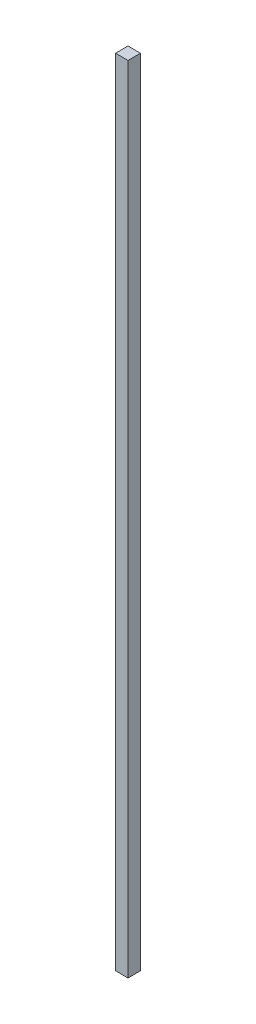
ISO-10303-21;
HEADER;
FILE_DESCRIPTION(('STEP AP214'),'2;1');
FILE_NAME('part.step','',(''),(''),'','','');
FILE_SCHEMA(('AUTOMOTIVE_DESIGN { 1 0 10303 214 1 1 1 1 }'));
ENDSEC;
DATA;
#1=APPLICATION_CONTEXT('core data for automotive mechanical design processes');
#2=APPLICATION_PROTOCOL_DEFINITION('international standard','automotive_design',2000,#1);
#3=PRODUCT_CONTEXT('',#1,'mechanical');
#4=PRODUCT('Part','Part','',(#3));
#5=PRODUCT_RELATED_PRODUCT_CATEGORY('part','',(#4));
#6=PRODUCT_DEFINITION_FORMATION('','',#4);
#7=PRODUCT_DEFINITION_CONTEXT('part definition',#1,'design');
#8=PRODUCT_DEFINITION('design','',#6,#7);
#9=PRODUCT_DEFINITION_SHAPE('','',#8);
#10=(LENGTH_UNIT() NAMED_UNIT(*) SI_UNIT(.MILLI.,.METRE.));
#11=(NAMED_UNIT(*) PLANE_ANGLE_UNIT() SI_UNIT($,.RADIAN.));
#12=(NAMED_UNIT(*) SI_UNIT($,.STERADIAN.) SOLID_ANGLE_UNIT());
#13=UNCERTAINTY_MEASURE_WITH_UNIT(LENGTH_MEASURE(1.E-05),#10,'distance_accuracy_value','');
#14=(GEOMETRIC_REPRESENTATION_CONTEXT(3) GLOBAL_UNCERTAINTY_ASSIGNED_CONTEXT((#13)) GLOBAL_UNIT_ASSIGNED_CONTEXT((#10,
#11,#12)) REPRESENTATION_CONTEXT('',''));
#15=CARTESIAN_POINT('',(0.,0.,0.));
#16=DIRECTION('',(0.,0.,1.));
#17=DIRECTION('',(1.,0.,0.));
#18=AXIS2_PLACEMENT_3D('',#15,#16,#17);
#19=CARTESIAN_POINT('',(-42.531066264103,3180.,-16.6753535674559));
#20=DIRECTION('',(1.,0.,0.));
#21=DIRECTION('',(0.,0.,-1.));
#22=AXIS2_PLACEMENT_3D('',#19,#20,#21);
#23=PLANE('',#22);
#24=DIRECTION('',(0.,0.,1.));
#25=VECTOR('',#24,1.);
#26=CARTESIAN_POINT('',(-42.531066264103,0.,-16.6753535674559));
#27=LINE('',#26,#25);
#28=CARTESIAN_POINT('',(-42.531066264103,0.,-16.6753535674559));
#29=VERTEX_POINT('',#28);
#30=CARTESIAN_POINT('',(-42.531066264103,0.,33.3246464325441));
#31=VERTEX_POINT('',#30);
#32=EDGE_CURVE('E98',#29,#31,#27,.T.);
#33=ORIENTED_EDGE('',*,*,#32,.T.);
#34=DIRECTION('',(0.,-1.,0.));
#35=VECTOR('',#34,1.);
#36=CARTESIAN_POINT('',(-42.531066264103,3180.,33.3246464325441));
#37=LINE('',#36,#35);
#38=CARTESIAN_POINT('',(-42.531066264103,3180.,33.3246464325441));
#39=VERTEX_POINT('',#38);
#40=EDGE_CURVE('E11',#39,#31,#37,.T.);
#41=ORIENTED_EDGE('',*,*,#40,.F.);
#42=DIRECTION('',(0.,0.,1.));
#43=VECTOR('',#42,1.);
#44=CARTESIAN_POINT('',(-42.531066264103,3180.,-16.6753535674559));
#45=LINE('',#44,#43);
#46=CARTESIAN_POINT('',(-42.531066264103,3180.,-16.6753535674559));
#47=VERTEX_POINT('',#46);
#48=EDGE_CURVE('E86',#47,#39,#45,.T.);
#49=ORIENTED_EDGE('',*,*,#48,.F.);
#50=DIRECTION('',(0.,-1.,0.));
#51=VECTOR('',#50,1.);
#52=CARTESIAN_POINT('',(-42.531066264103,3180.,-16.6753535674559));
#53=LINE('',#52,#51);
#54=EDGE_CURVE('E94',#47,#29,#53,.T.);
#55=ORIENTED_EDGE('',*,*,#54,.T.);
#56=EDGE_LOOP('',(#33,#41,#49,#55));
#57=FACE_BOUND('',#56,.T.);
#58=ADVANCED_FACE('F35',(#57),#23,.F.);
#59=CARTESIAN_POINT('',(-42.531066264103,3180.,33.3246464325441));
#60=DIRECTION('',(0.,0.,-1.));
#61=DIRECTION('',(-1.,0.,0.));
#62=AXIS2_PLACEMENT_3D('',#59,#60,#61);
#63=PLANE('',#62);
#64=DIRECTION('',(1.,0.,0.));
#65=VECTOR('',#64,1.);
#66=CARTESIAN_POINT('',(-42.531066264103,0.,33.3246464325441));
#67=LINE('',#66,#65);
#68=CARTESIAN_POINT('',(7.46893373589703,0.,33.3246464325441));
#69=VERTEX_POINT('',#68);
#70=EDGE_CURVE('E90',#31,#69,#67,.T.);
#71=ORIENTED_EDGE('',*,*,#70,.T.);
#72=DIRECTION('',(0.,-1.,0.));
#73=VECTOR('',#72,1.);
#74=CARTESIAN_POINT('',(7.46893373589703,3180.,33.3246464325441));
#75=LINE('',#74,#73);
#76=CARTESIAN_POINT('',(7.46893373589703,3180.,33.3246464325441));
#77=VERTEX_POINT('',#76);
#78=EDGE_CURVE('E43',#77,#69,#75,.T.);
#79=ORIENTED_EDGE('',*,*,#78,.F.);
#80=DIRECTION('',(1.,0.,0.));
#81=VECTOR('',#80,1.);
#82=CARTESIAN_POINT('',(-42.531066264103,3180.,33.3246464325441));
#83=LINE('',#82,#81);
#84=EDGE_CURVE('E81',#39,#77,#83,.T.);
#85=ORIENTED_EDGE('',*,*,#84,.F.);
#86=ORIENTED_EDGE('',*,*,#40,.T.);
#87=EDGE_LOOP('',(#71,#79,#85,#86));
#88=FACE_BOUND('',#87,.T.);
#89=ADVANCED_FACE('F89',(#88),#63,.F.);
#90=CARTESIAN_POINT('',(7.46893373589703,3180.,-16.6753535674559));
#91=DIRECTION('',(-1.,0.,0.));
#92=DIRECTION('',(0.,0.,1.));
#93=AXIS2_PLACEMENT_3D('',#90,#91,#92);
#94=PLANE('',#93);
#95=DIRECTION('',(0.,0.,-1.));
#96=VECTOR('',#95,1.);
#97=CARTESIAN_POINT('',(7.46893373589703,0.,-16.6753535674559));
#98=LINE('',#97,#96);
#99=CARTESIAN_POINT('',(7.46893373589703,0.,-16.6753535674559));
#100=VERTEX_POINT('',#99);
#101=EDGE_CURVE('E68',#69,#100,#98,.T.);
#102=ORIENTED_EDGE('',*,*,#101,.T.);
#103=DIRECTION('',(0.,-1.,0.));
#104=VECTOR('',#103,1.);
#105=CARTESIAN_POINT('',(7.46893373589703,3180.,-16.6753535674559));
#106=LINE('',#105,#104);
#107=CARTESIAN_POINT('',(7.46893373589703,3180.,-16.6753535674559));
#108=VERTEX_POINT('',#107);
#109=EDGE_CURVE('E91',#108,#100,#106,.T.);
#110=ORIENTED_EDGE('',*,*,#109,.F.);
#111=DIRECTION('',(0.,0.,-1.));
#112=VECTOR('',#111,1.);
#113=CARTESIAN_POINT('',(7.46893373589703,3180.,-16.6753535674559));
#114=LINE('',#113,#112);
#115=EDGE_CURVE('E84',#77,#108,#114,.T.);
#116=ORIENTED_EDGE('',*,*,#115,.F.);
#117=ORIENTED_EDGE('',*,*,#78,.T.);
#118=EDGE_LOOP('',(#102,#110,#116,#117));
#119=FACE_BOUND('',#118,.T.);
#120=ADVANCED_FACE('F92',(#119),#94,.F.);
#121=CARTESIAN_POINT('',(-42.531066264103,3180.,-16.6753535674559));
#122=DIRECTION('',(0.,0.,1.));
#123=DIRECTION('',(1.,0.,0.));
#124=AXIS2_PLACEMENT_3D('',#121,#122,#123);
#125=PLANE('',#124);
#126=DIRECTION('',(-1.,0.,0.));
#127=VECTOR('',#126,1.);
#128=CARTESIAN_POINT('',(-42.531066264103,0.,-16.6753535674559));
#129=LINE('',#128,#127);
#130=EDGE_CURVE('E74',#100,#29,#129,.T.);
#131=ORIENTED_EDGE('',*,*,#130,.T.);
#132=ORIENTED_EDGE('',*,*,#54,.F.);
#133=DIRECTION('',(-1.,0.,0.));
#134=VECTOR('',#133,1.);
#135=CARTESIAN_POINT('',(-42.531066264103,3180.,-16.6753535674559));
#136=LINE('',#135,#134);
#137=EDGE_CURVE('E51',#108,#47,#136,.T.);
#138=ORIENTED_EDGE('',*,*,#137,.F.);
#139=ORIENTED_EDGE('',*,*,#109,.T.);
#140=EDGE_LOOP('',(#131,#132,#138,#139));
#141=FACE_BOUND('',#140,.T.);
#142=ADVANCED_FACE('F105',(#141),#125,.F.);
#143=CARTESIAN_POINT('',(0.,3180.,0.));
#144=DIRECTION('',(0.,1.,0.));
#145=DIRECTION('',(0.,0.,1.));
#146=AXIS2_PLACEMENT_3D('',#143,#144,#145);
#147=PLANE('',#146);
#148=ORIENTED_EDGE('',*,*,#48,.T.);
#149=ORIENTED_EDGE('',*,*,#84,.T.);
#150=ORIENTED_EDGE('',*,*,#115,.T.);
#151=ORIENTED_EDGE('',*,*,#137,.T.);
#152=EDGE_LOOP('',(#148,#149,#150,#151));
#153=FACE_BOUND('',#152,.T.);
#154=ADVANCED_FACE('F82',(#153),#147,.T.);
#155=CARTESIAN_POINT('',(0.,0.,0.));
#156=DIRECTION('',(0.,1.,0.));
#157=DIRECTION('',(0.,0.,1.));
#158=AXIS2_PLACEMENT_3D('',#155,#156,#157);
#159=PLANE('',#158);
#160=ORIENTED_EDGE('',*,*,#32,.F.);
#161=ORIENTED_EDGE('',*,*,#130,.F.);
#162=ORIENTED_EDGE('',*,*,#101,.F.);
#163=ORIENTED_EDGE('',*,*,#70,.F.);
#164=EDGE_LOOP('',(#160,#161,#162,#163));
#165=FACE_BOUND('',#164,.T.);
#166=ADVANCED_FACE('F108',(#165),#159,.F.);
#167=CLOSED_SHELL('',(#58,#89,#120,#142,#154,#166));
#168=MANIFOLD_SOLID_BREP('B2',#167);
#169=ADVANCED_BREP_SHAPE_REPRESENTATION('',(#18,#168),#14);
#170=SHAPE_DEFINITION_REPRESENTATION(#9,#169);
ENDSEC;
END-ISO-10303-21;
